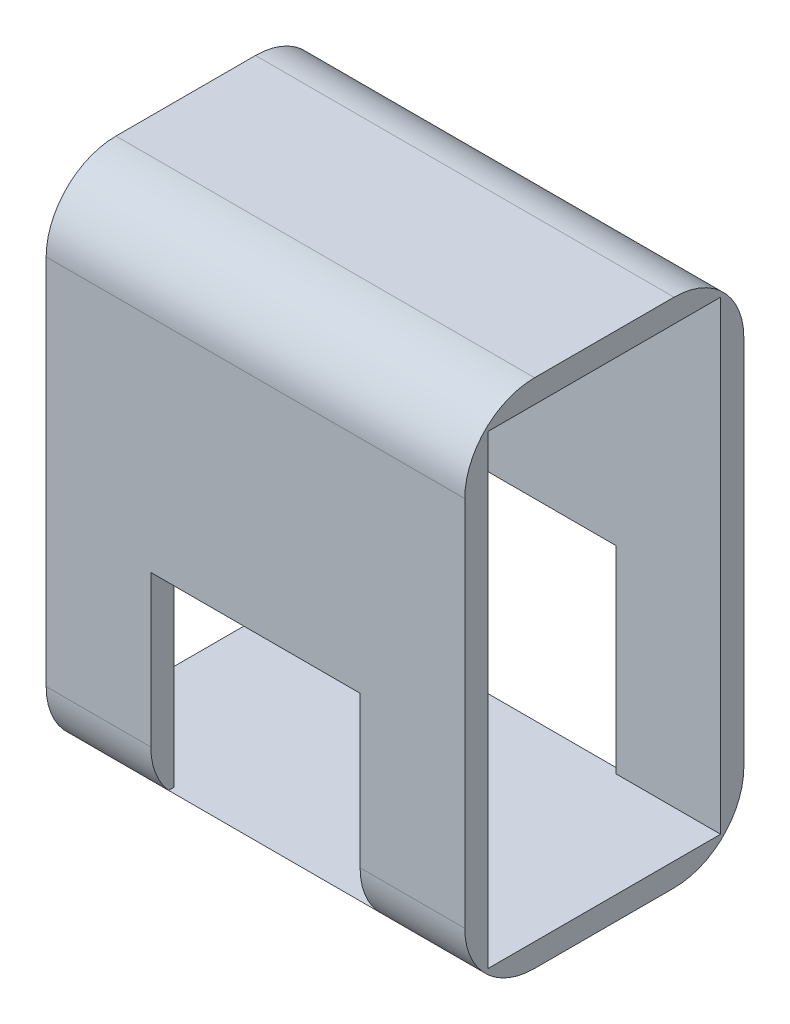
ISO-10303-21;
HEADER;
FILE_DESCRIPTION(('STEP AP214'),'2;1');
FILE_NAME('part.step','',(''),(''),'','','');
FILE_SCHEMA(('AUTOMOTIVE_DESIGN { 1 0 10303 214 1 1 1 1 }'));
ENDSEC;
DATA;
#1=APPLICATION_CONTEXT('core data for automotive mechanical design processes');
#2=APPLICATION_PROTOCOL_DEFINITION('international standard','automotive_design',2000,#1);
#3=PRODUCT_CONTEXT('',#1,'mechanical');
#4=PRODUCT('Part','Part','',(#3));
#5=PRODUCT_RELATED_PRODUCT_CATEGORY('part','',(#4));
#6=PRODUCT_DEFINITION_FORMATION('','',#4);
#7=PRODUCT_DEFINITION_CONTEXT('part definition',#1,'design');
#8=PRODUCT_DEFINITION('design','',#6,#7);
#9=PRODUCT_DEFINITION_SHAPE('','',#8);
#10=(LENGTH_UNIT() NAMED_UNIT(*) SI_UNIT(.MILLI.,.METRE.));
#11=(NAMED_UNIT(*) PLANE_ANGLE_UNIT() SI_UNIT($,.RADIAN.));
#12=(NAMED_UNIT(*) SI_UNIT($,.STERADIAN.) SOLID_ANGLE_UNIT());
#13=UNCERTAINTY_MEASURE_WITH_UNIT(LENGTH_MEASURE(1.E-05),#10,'distance_accuracy_value','');
#14=(GEOMETRIC_REPRESENTATION_CONTEXT(3) GLOBAL_UNCERTAINTY_ASSIGNED_CONTEXT((#13)) GLOBAL_UNIT_ASSIGNED_CONTEXT((#10,
#11,#12)) REPRESENTATION_CONTEXT('',''));
#15=CARTESIAN_POINT('',(0.,0.,0.));
#16=DIRECTION('',(0.,0.,1.));
#17=DIRECTION('',(1.,0.,0.));
#18=AXIS2_PLACEMENT_3D('',#15,#16,#17);
#19=CARTESIAN_POINT('',(0.,-10.,5.));
#20=DIRECTION('',(0.,-1.,0.));
#21=DIRECTION('',(0.,0.,-1.));
#22=AXIS2_PLACEMENT_3D('',#19,#20,#21);
#23=PLANE('',#22);
#24=DIRECTION('',(0.,0.,1.));
#25=VECTOR('',#24,1.);
#26=CARTESIAN_POINT('',(4.5,-10.,-5.11803398875));
#27=LINE('',#26,#25);
#28=CARTESIAN_POINT('',(4.5,-10.,-5.2360679775));
#29=VERTEX_POINT('',#28);
#30=CARTESIAN_POINT('',(4.5,-10.,-5.));
#31=VERTEX_POINT('',#30);
#32=EDGE_CURVE('E173',#29,#31,#27,.T.);
#33=ORIENTED_EDGE('',*,*,#32,.F.);
#34=DIRECTION('',(1.,0.,0.));
#35=VECTOR('',#34,1.);
#36=CARTESIAN_POINT('',(0.,-10.,-5.2360679775));
#37=LINE('',#36,#35);
#38=CARTESIAN_POINT('',(-4.5,-10.,-5.2360679775));
#39=VERTEX_POINT('',#38);
#40=EDGE_CURVE('E272',#39,#29,#37,.T.);
#41=ORIENTED_EDGE('',*,*,#40,.F.);
#42=DIRECTION('',(0.,0.,1.));
#43=VECTOR('',#42,1.);
#44=CARTESIAN_POINT('',(-4.5,-10.,-5.11803398875));
#45=LINE('',#44,#43);
#46=CARTESIAN_POINT('',(-4.5,-10.,-5.));
#47=VERTEX_POINT('',#46);
#48=EDGE_CURVE('E203',#39,#47,#45,.T.);
#49=ORIENTED_EDGE('',*,*,#48,.T.);
#50=DIRECTION('',(1.,0.,0.));
#51=VECTOR('',#50,1.);
#52=CARTESIAN_POINT('',(-6.75,-10.,-5.));
#53=LINE('',#52,#51);
#54=CARTESIAN_POINT('',(-9.,-10.,-5.));
#55=VERTEX_POINT('',#54);
#56=EDGE_CURVE('E198',#55,#47,#53,.T.);
#57=ORIENTED_EDGE('',*,*,#56,.F.);
#58=DIRECTION('',(0.,0.,-1.));
#59=VECTOR('',#58,1.);
#60=CARTESIAN_POINT('',(-9.,-10.,0.));
#61=LINE('',#60,#59);
#62=CARTESIAN_POINT('',(-9.,-10.,5.));
#63=VERTEX_POINT('',#62);
#64=EDGE_CURVE('E326',#63,#55,#61,.T.);
#65=ORIENTED_EDGE('',*,*,#64,.F.);
#66=DIRECTION('',(1.,0.,0.));
#67=VECTOR('',#66,1.);
#68=CARTESIAN_POINT('',(-6.75,-10.,5.));
#69=LINE('',#68,#67);
#70=CARTESIAN_POINT('',(-4.5,-10.,5.));
#71=VERTEX_POINT('',#70);
#72=EDGE_CURVE('E186',#63,#71,#69,.T.);
#73=ORIENTED_EDGE('',*,*,#72,.T.);
#74=DIRECTION('',(0.,0.,1.));
#75=VECTOR('',#74,1.);
#76=CARTESIAN_POINT('',(-4.5,-10.,5.11803398875));
#77=LINE('',#76,#75);
#78=CARTESIAN_POINT('',(-4.5,-10.,5.2360679775));
#79=VERTEX_POINT('',#78);
#80=EDGE_CURVE('E11',#71,#79,#77,.T.);
#81=ORIENTED_EDGE('',*,*,#80,.T.);
#82=DIRECTION('',(1.,0.,0.));
#83=VECTOR('',#82,1.);
#84=CARTESIAN_POINT('',(0.,-10.,5.2360679775));
#85=LINE('',#84,#83);
#86=CARTESIAN_POINT('',(4.5,-10.,5.2360679775));
#87=VERTEX_POINT('',#86);
#88=EDGE_CURVE('E277',#79,#87,#85,.T.);
#89=ORIENTED_EDGE('',*,*,#88,.T.);
#90=DIRECTION('',(0.,0.,1.));
#91=VECTOR('',#90,1.);
#92=CARTESIAN_POINT('',(4.5,-10.,5.11803398875));
#93=LINE('',#92,#91);
#94=CARTESIAN_POINT('',(4.5,-10.,5.));
#95=VERTEX_POINT('',#94);
#96=EDGE_CURVE('E20',#95,#87,#93,.T.);
#97=ORIENTED_EDGE('',*,*,#96,.F.);
#98=DIRECTION('',(1.,0.,0.));
#99=VECTOR('',#98,1.);
#100=CARTESIAN_POINT('',(6.75,-10.,5.));
#101=LINE('',#100,#99);
#102=CARTESIAN_POINT('',(9.,-10.,5.));
#103=VERTEX_POINT('',#102);
#104=EDGE_CURVE('E369',#95,#103,#101,.T.);
#105=ORIENTED_EDGE('',*,*,#104,.T.);
#106=DIRECTION('',(0.,0.,-1.));
#107=VECTOR('',#106,1.);
#108=CARTESIAN_POINT('',(9.,-10.,0.));
#109=LINE('',#108,#107);
#110=CARTESIAN_POINT('',(9.,-10.,-5.));
#111=VERTEX_POINT('',#110);
#112=EDGE_CURVE('E332',#103,#111,#109,.T.);
#113=ORIENTED_EDGE('',*,*,#112,.T.);
#114=DIRECTION('',(1.,0.,0.));
#115=VECTOR('',#114,1.);
#116=CARTESIAN_POINT('',(6.75,-10.,-5.));
#117=LINE('',#116,#115);
#118=EDGE_CURVE('E375',#31,#111,#117,.T.);
#119=ORIENTED_EDGE('',*,*,#118,.F.);
#120=EDGE_LOOP('',(#33,#41,#49,#57,#65,#73,#81,#89,#97,#105,#113,#119));
#121=FACE_BOUND('',#120,.T.);
#122=ADVANCED_FACE('F16',(#121),#23,.F.);
#123=CARTESIAN_POINT('',(4.5,-1.5,-6.));
#124=DIRECTION('',(0.,1.,0.));
#125=DIRECTION('',(1.,0.,0.));
#126=AXIS2_PLACEMENT_3D('',#123,#124,#125);
#127=PLANE('',#126);
#128=DIRECTION('',(0.,0.,1.));
#129=VECTOR('',#128,1.);
#130=CARTESIAN_POINT('',(4.5,-1.5,5.5));
#131=LINE('',#130,#129);
#132=CARTESIAN_POINT('',(4.5,-1.5,5.));
#133=VERTEX_POINT('',#132);
#134=CARTESIAN_POINT('',(4.5,-1.5,6.));
#135=VERTEX_POINT('',#134);
#136=EDGE_CURVE('E242',#133,#135,#131,.T.);
#137=ORIENTED_EDGE('',*,*,#136,.T.);
#138=DIRECTION('',(-1.,0.,0.));
#139=VECTOR('',#138,1.);
#140=CARTESIAN_POINT('',(0.,-1.5,6.));
#141=LINE('',#140,#139);
#142=CARTESIAN_POINT('',(-4.5,-1.5,6.));
#143=VERTEX_POINT('',#142);
#144=EDGE_CURVE('E293',#135,#143,#141,.T.);
#145=ORIENTED_EDGE('',*,*,#144,.T.);
#146=DIRECTION('',(0.,0.,1.));
#147=VECTOR('',#146,1.);
#148=CARTESIAN_POINT('',(-4.5,-1.5,5.5));
#149=LINE('',#148,#147);
#150=CARTESIAN_POINT('',(-4.5,-1.5,5.));
#151=VERTEX_POINT('',#150);
#152=EDGE_CURVE('E27',#151,#143,#149,.T.);
#153=ORIENTED_EDGE('',*,*,#152,.F.);
#154=DIRECTION('',(-1.,0.,0.));
#155=VECTOR('',#154,1.);
#156=CARTESIAN_POINT('',(0.,-1.5,5.));
#157=LINE('',#156,#155);
#158=EDGE_CURVE('E294',#133,#151,#157,.T.);
#159=ORIENTED_EDGE('',*,*,#158,.F.);
#160=EDGE_LOOP('',(#137,#145,#153,#159));
#161=FACE_BOUND('',#160,.T.);
#162=ADVANCED_FACE('F590',(#161),#127,.F.);
#163=CARTESIAN_POINT('',(-4.5,-10.,-6.));
#164=DIRECTION('',(1.,0.,0.));
#165=DIRECTION('',(0.,1.,0.));
#166=AXIS2_PLACEMENT_3D('',#163,#164,#165);
#167=PLANE('',#166);
#168=DIRECTION('',(0.,1.,0.));
#169=VECTOR('',#168,1.);
#170=CARTESIAN_POINT('',(-4.5,-5.75,5.));
#171=LINE('',#170,#169);
#172=EDGE_CURVE('E206',#71,#151,#171,.T.);
#173=ORIENTED_EDGE('',*,*,#172,.T.);
#174=ORIENTED_EDGE('',*,*,#152,.T.);
#175=DIRECTION('',(0.,1.,0.));
#176=VECTOR('',#175,1.);
#177=CARTESIAN_POINT('',(-4.5,-4.75,6.));
#178=LINE('',#177,#176);
#179=CARTESIAN_POINT('',(-4.5,-8.,6.));
#180=VERTEX_POINT('',#179);
#181=EDGE_CURVE('E289',#180,#143,#178,.T.);
#182=ORIENTED_EDGE('',*,*,#181,.F.);
#183=CARTESIAN_POINT('',(-4.5,-8.,3.));
#184=DIRECTION('',(1.,0.,0.));
#185=DIRECTION('',(0.,1.,0.));
#186=AXIS2_PLACEMENT_3D('',#183,#184,#185);
#187=CIRCLE('',#186,3.);
#188=EDGE_CURVE('E281',#180,#79,#187,.T.);
#189=ORIENTED_EDGE('',*,*,#188,.T.);
#190=ORIENTED_EDGE('',*,*,#80,.F.);
#191=EDGE_LOOP('',(#173,#174,#182,#189,#190));
#192=FACE_BOUND('',#191,.T.);
#193=ADVANCED_FACE('F502',(#192),#167,.T.);
#194=CARTESIAN_POINT('',(4.5,-1.5,-6.));
#195=DIRECTION('',(-1.,0.,0.));
#196=DIRECTION('',(0.,0.,1.));
#197=AXIS2_PLACEMENT_3D('',#194,#195,#196);
#198=PLANE('',#197);
#199=DIRECTION('',(0.,1.,0.));
#200=VECTOR('',#199,1.);
#201=CARTESIAN_POINT('',(4.5,-5.75,5.));
#202=LINE('',#201,#200);
#203=EDGE_CURVE('E297',#95,#133,#202,.T.);
#204=ORIENTED_EDGE('',*,*,#203,.F.);
#205=ORIENTED_EDGE('',*,*,#96,.T.);
#206=CARTESIAN_POINT('',(4.5,-8.,3.));
#207=DIRECTION('',(-1.,0.,0.));
#208=DIRECTION('',(0.,1.,0.));
#209=AXIS2_PLACEMENT_3D('',#206,#207,#208);
#210=CIRCLE('',#209,3.);
#211=CARTESIAN_POINT('',(4.5,-8.,6.));
#212=VERTEX_POINT('',#211);
#213=EDGE_CURVE('E246',#87,#212,#210,.T.);
#214=ORIENTED_EDGE('',*,*,#213,.T.);
#215=DIRECTION('',(0.,1.,0.));
#216=VECTOR('',#215,1.);
#217=CARTESIAN_POINT('',(4.5,-4.75,6.));
#218=LINE('',#217,#216);
#219=EDGE_CURVE('E372',#212,#135,#218,.T.);
#220=ORIENTED_EDGE('',*,*,#219,.T.);
#221=ORIENTED_EDGE('',*,*,#136,.F.);
#222=EDGE_LOOP('',(#204,#205,#214,#220,#221));
#223=FACE_BOUND('',#222,.T.);
#224=ADVANCED_FACE('F18',(#223),#198,.T.);
#225=CARTESIAN_POINT('',(4.5,-1.5,-6.));
#226=DIRECTION('',(0.,1.,0.));
#227=DIRECTION('',(1.,0.,0.));
#228=AXIS2_PLACEMENT_3D('',#225,#226,#227);
#229=PLANE('',#228);
#230=DIRECTION('',(-1.,0.,0.));
#231=VECTOR('',#230,1.);
#232=CARTESIAN_POINT('',(0.,-1.5,-5.));
#233=LINE('',#232,#231);
#234=CARTESIAN_POINT('',(4.5,-1.5,-5.));
#235=VERTEX_POINT('',#234);
#236=CARTESIAN_POINT('',(-4.5,-1.5,-5.));
#237=VERTEX_POINT('',#236);
#238=EDGE_CURVE('E165',#235,#237,#233,.T.);
#239=ORIENTED_EDGE('',*,*,#238,.T.);
#240=DIRECTION('',(0.,0.,1.));
#241=VECTOR('',#240,1.);
#242=CARTESIAN_POINT('',(-4.5,-1.5,-5.5));
#243=LINE('',#242,#241);
#244=CARTESIAN_POINT('',(-4.5,-1.5,-6.));
#245=VERTEX_POINT('',#244);
#246=EDGE_CURVE('E174',#245,#237,#243,.T.);
#247=ORIENTED_EDGE('',*,*,#246,.F.);
#248=DIRECTION('',(1.,0.,0.));
#249=VECTOR('',#248,1.);
#250=CARTESIAN_POINT('',(0.,-1.5,-6.));
#251=LINE('',#250,#249);
#252=CARTESIAN_POINT('',(4.5,-1.5,-6.));
#253=VERTEX_POINT('',#252);
#254=EDGE_CURVE('E168',#245,#253,#251,.T.);
#255=ORIENTED_EDGE('',*,*,#254,.T.);
#256=DIRECTION('',(0.,0.,1.));
#257=VECTOR('',#256,1.);
#258=CARTESIAN_POINT('',(4.5,-1.5,-5.5));
#259=LINE('',#258,#257);
#260=EDGE_CURVE('E160',#253,#235,#259,.T.);
#261=ORIENTED_EDGE('',*,*,#260,.T.);
#262=EDGE_LOOP('',(#239,#247,#255,#261));
#263=FACE_BOUND('',#262,.T.);
#264=ADVANCED_FACE('F162',(#263),#229,.F.);
#265=CARTESIAN_POINT('',(4.5,-1.5,-6.));
#266=DIRECTION('',(-1.,0.,0.));
#267=DIRECTION('',(0.,0.,1.));
#268=AXIS2_PLACEMENT_3D('',#265,#266,#267);
#269=PLANE('',#268);
#270=DIRECTION('',(0.,1.,0.));
#271=VECTOR('',#270,1.);
#272=CARTESIAN_POINT('',(4.5,-5.75,-5.));
#273=LINE('',#272,#271);
#274=EDGE_CURVE('E178',#31,#235,#273,.T.);
#275=ORIENTED_EDGE('',*,*,#274,.T.);
#276=ORIENTED_EDGE('',*,*,#260,.F.);
#277=DIRECTION('',(0.,-1.,0.));
#278=VECTOR('',#277,1.);
#279=CARTESIAN_POINT('',(4.5,-4.75,-6.));
#280=LINE('',#279,#278);
#281=CARTESIAN_POINT('',(4.5,-8.,-6.));
#282=VERTEX_POINT('',#281);
#283=EDGE_CURVE('E276',#253,#282,#280,.T.);
#284=ORIENTED_EDGE('',*,*,#283,.T.);
#285=CARTESIAN_POINT('',(4.5,-8.,-3.));
#286=DIRECTION('',(-1.,0.,0.));
#287=DIRECTION('',(0.,1.,0.));
#288=AXIS2_PLACEMENT_3D('',#285,#286,#287);
#289=CIRCLE('',#288,3.);
#290=EDGE_CURVE('E269',#282,#29,#289,.T.);
#291=ORIENTED_EDGE('',*,*,#290,.T.);
#292=ORIENTED_EDGE('',*,*,#32,.T.);
#293=EDGE_LOOP('',(#275,#276,#284,#291,#292));
#294=FACE_BOUND('',#293,.T.);
#295=ADVANCED_FACE('F179',(#294),#269,.T.);
#296=CARTESIAN_POINT('',(-4.5,-10.,-6.));
#297=DIRECTION('',(1.,0.,0.));
#298=DIRECTION('',(0.,1.,0.));
#299=AXIS2_PLACEMENT_3D('',#296,#297,#298);
#300=PLANE('',#299);
#301=DIRECTION('',(0.,1.,0.));
#302=VECTOR('',#301,1.);
#303=CARTESIAN_POINT('',(-4.5,-5.75,-5.));
#304=LINE('',#303,#302);
#305=EDGE_CURVE('E191',#47,#237,#304,.T.);
#306=ORIENTED_EDGE('',*,*,#305,.F.);
#307=ORIENTED_EDGE('',*,*,#48,.F.);
#308=CARTESIAN_POINT('',(-4.5,-8.,-3.));
#309=DIRECTION('',(1.,0.,0.));
#310=DIRECTION('',(0.,1.,0.));
#311=AXIS2_PLACEMENT_3D('',#308,#309,#310);
#312=CIRCLE('',#311,3.);
#313=CARTESIAN_POINT('',(-4.5,-8.,-6.));
#314=VERTEX_POINT('',#313);
#315=EDGE_CURVE('E351',#39,#314,#312,.T.);
#316=ORIENTED_EDGE('',*,*,#315,.T.);
#317=DIRECTION('',(0.,1.,0.));
#318=VECTOR('',#317,1.);
#319=CARTESIAN_POINT('',(-4.5,-4.75,-6.));
#320=LINE('',#319,#318);
#321=EDGE_CURVE('E275',#314,#245,#320,.T.);
#322=ORIENTED_EDGE('',*,*,#321,.T.);
#323=ORIENTED_EDGE('',*,*,#246,.T.);
#324=EDGE_LOOP('',(#306,#307,#316,#322,#323));
#325=FACE_BOUND('',#324,.T.);
#326=ADVANCED_FACE('F467',(#325),#300,.T.);
#327=CARTESIAN_POINT('',(0.,-10.,5.));
#328=DIRECTION('',(0.,0.,-1.));
#329=DIRECTION('',(0.,-1.,0.));
#330=AXIS2_PLACEMENT_3D('',#327,#328,#329);
#331=PLANE('',#330);
#332=ORIENTED_EDGE('',*,*,#72,.F.);
#333=DIRECTION('',(0.,-1.,0.));
#334=VECTOR('',#333,1.);
#335=CARTESIAN_POINT('',(-9.,0.,5.));
#336=LINE('',#335,#334);
#337=CARTESIAN_POINT('',(-9.,10.,5.));
#338=VERTEX_POINT('',#337);
#339=EDGE_CURVE('E259',#338,#63,#336,.T.);
#340=ORIENTED_EDGE('',*,*,#339,.F.);
#341=DIRECTION('',(1.,0.,0.));
#342=VECTOR('',#341,1.);
#343=CARTESIAN_POINT('',(0.,10.,5.));
#344=LINE('',#343,#342);
#345=CARTESIAN_POINT('',(9.,10.,5.));
#346=VERTEX_POINT('',#345);
#347=EDGE_CURVE('E288',#338,#346,#344,.T.);
#348=ORIENTED_EDGE('',*,*,#347,.T.);
#349=DIRECTION('',(0.,-1.,0.));
#350=VECTOR('',#349,1.);
#351=CARTESIAN_POINT('',(9.,0.,5.));
#352=LINE('',#351,#350);
#353=EDGE_CURVE('E355',#346,#103,#352,.T.);
#354=ORIENTED_EDGE('',*,*,#353,.T.);
#355=ORIENTED_EDGE('',*,*,#104,.F.);
#356=ORIENTED_EDGE('',*,*,#203,.T.);
#357=ORIENTED_EDGE('',*,*,#158,.T.);
#358=ORIENTED_EDGE('',*,*,#172,.F.);
#359=EDGE_LOOP('',(#332,#340,#348,#354,#355,#356,#357,#358));
#360=FACE_BOUND('',#359,.T.);
#361=ADVANCED_FACE('F432',(#360),#331,.T.);
#362=CARTESIAN_POINT('',(0.,10.,-5.));
#363=DIRECTION('',(0.,0.,1.));
#364=DIRECTION('',(1.,0.,0.));
#365=AXIS2_PLACEMENT_3D('',#362,#363,#364);
#366=PLANE('',#365);
#367=ORIENTED_EDGE('',*,*,#118,.T.);
#368=DIRECTION('',(0.,1.,0.));
#369=VECTOR('',#368,1.);
#370=CARTESIAN_POINT('',(9.,0.,-5.));
#371=LINE('',#370,#369);
#372=CARTESIAN_POINT('',(9.,10.,-5.));
#373=VERTEX_POINT('',#372);
#374=EDGE_CURVE('E201',#111,#373,#371,.T.);
#375=ORIENTED_EDGE('',*,*,#374,.T.);
#376=DIRECTION('',(1.,0.,0.));
#377=VECTOR('',#376,1.);
#378=CARTESIAN_POINT('',(0.,10.,-5.));
#379=LINE('',#378,#377);
#380=CARTESIAN_POINT('',(-9.,10.,-5.));
#381=VERTEX_POINT('',#380);
#382=EDGE_CURVE('E254',#381,#373,#379,.T.);
#383=ORIENTED_EDGE('',*,*,#382,.F.);
#384=DIRECTION('',(0.,1.,0.));
#385=VECTOR('',#384,1.);
#386=CARTESIAN_POINT('',(-9.,0.,-5.));
#387=LINE('',#386,#385);
#388=EDGE_CURVE('E264',#55,#381,#387,.T.);
#389=ORIENTED_EDGE('',*,*,#388,.F.);
#390=ORIENTED_EDGE('',*,*,#56,.T.);
#391=ORIENTED_EDGE('',*,*,#305,.T.);
#392=ORIENTED_EDGE('',*,*,#238,.F.);
#393=ORIENTED_EDGE('',*,*,#274,.F.);
#394=EDGE_LOOP('',(#367,#375,#383,#389,#390,#391,#392,#393));
#395=FACE_BOUND('',#394,.T.);
#396=ADVANCED_FACE('F188',(#395),#366,.T.);
#397=CARTESIAN_POINT('',(0.,11.,6.));
#398=DIRECTION('',(0.,0.,1.));
#399=DIRECTION('',(1.,0.,0.));
#400=AXIS2_PLACEMENT_3D('',#397,#398,#399);
#401=PLANE('',#400);
#402=DIRECTION('',(1.,0.,0.));
#403=VECTOR('',#402,1.);
#404=CARTESIAN_POINT('',(0.,-8.,6.));
#405=LINE('',#404,#403);
#406=CARTESIAN_POINT('',(9.,-8.,6.));
#407=VERTEX_POINT('',#406);
#408=EDGE_CURVE('E244',#212,#407,#405,.T.);
#409=ORIENTED_EDGE('',*,*,#408,.T.);
#410=DIRECTION('',(0.,-1.,0.));
#411=VECTOR('',#410,1.);
#412=CARTESIAN_POINT('',(9.,0.,6.));
#413=LINE('',#412,#411);
#414=CARTESIAN_POINT('',(9.,8.,6.));
#415=VERTEX_POINT('',#414);
#416=EDGE_CURVE('E263',#415,#407,#413,.T.);
#417=ORIENTED_EDGE('',*,*,#416,.F.);
#418=DIRECTION('',(1.,0.,0.));
#419=VECTOR('',#418,1.);
#420=CARTESIAN_POINT('',(0.,8.,6.));
#421=LINE('',#420,#419);
#422=CARTESIAN_POINT('',(-9.,8.,6.));
#423=VERTEX_POINT('',#422);
#424=EDGE_CURVE('E213',#423,#415,#421,.T.);
#425=ORIENTED_EDGE('',*,*,#424,.F.);
#426=DIRECTION('',(0.,-1.,0.));
#427=VECTOR('',#426,1.);
#428=CARTESIAN_POINT('',(-9.,0.,6.));
#429=LINE('',#428,#427);
#430=CARTESIAN_POINT('',(-9.,-8.,6.));
#431=VERTEX_POINT('',#430);
#432=EDGE_CURVE('E323',#423,#431,#429,.T.);
#433=ORIENTED_EDGE('',*,*,#432,.T.);
#434=DIRECTION('',(1.,0.,0.));
#435=VECTOR('',#434,1.);
#436=CARTESIAN_POINT('',(0.,-8.,6.));
#437=LINE('',#436,#435);
#438=EDGE_CURVE('E247',#431,#180,#437,.T.);
#439=ORIENTED_EDGE('',*,*,#438,.T.);
#440=ORIENTED_EDGE('',*,*,#181,.T.);
#441=ORIENTED_EDGE('',*,*,#144,.F.);
#442=ORIENTED_EDGE('',*,*,#219,.F.);
#443=EDGE_LOOP('',(#409,#417,#425,#433,#439,#440,#441,#442));
#444=FACE_BOUND('',#443,.T.);
#445=ADVANCED_FACE('F541',(#444),#401,.T.);
#446=CARTESIAN_POINT('',(0.,-8.,3.));
#447=DIRECTION('',(1.,0.,0.));
#448=DIRECTION('',(0.,0.,1.));
#449=AXIS2_PLACEMENT_3D('',#446,#447,#448);
#450=CYLINDRICAL_SURFACE('',#449,3.);
#451=ORIENTED_EDGE('',*,*,#438,.F.);
#452=CARTESIAN_POINT('',(-9.,-8.,3.));
#453=DIRECTION('',(1.,0.,0.));
#454=DIRECTION('',(0.,1.,0.));
#455=AXIS2_PLACEMENT_3D('',#452,#453,#454);
#456=CIRCLE('',#455,3.);
#457=CARTESIAN_POINT('',(-9.,-11.,3.));
#458=VERTEX_POINT('',#457);
#459=EDGE_CURVE('E327',#431,#458,#456,.T.);
#460=ORIENTED_EDGE('',*,*,#459,.T.);
#461=DIRECTION('',(1.,0.,0.));
#462=VECTOR('',#461,1.);
#463=CARTESIAN_POINT('',(0.,-11.,3.));
#464=LINE('',#463,#462);
#465=CARTESIAN_POINT('',(9.,-11.,3.));
#466=VERTEX_POINT('',#465);
#467=EDGE_CURVE('E226',#458,#466,#464,.T.);
#468=ORIENTED_EDGE('',*,*,#467,.T.);
#469=CARTESIAN_POINT('',(9.,-8.,3.));
#470=DIRECTION('',(-1.,0.,0.));
#471=DIRECTION('',(0.,1.,0.));
#472=AXIS2_PLACEMENT_3D('',#469,#470,#471);
#473=CIRCLE('',#472,3.);
#474=EDGE_CURVE('E343',#466,#407,#473,.T.);
#475=ORIENTED_EDGE('',*,*,#474,.T.);
#476=ORIENTED_EDGE('',*,*,#408,.F.);
#477=ORIENTED_EDGE('',*,*,#213,.F.);
#478=ORIENTED_EDGE('',*,*,#88,.F.);
#479=ORIENTED_EDGE('',*,*,#188,.F.);
#480=EDGE_LOOP('',(#451,#460,#468,#475,#476,#477,#478,#479));
#481=FACE_BOUND('',#480,.T.);
#482=ADVANCED_FACE('F560',(#481),#450,.T.);
#483=CARTESIAN_POINT('',(0.,-8.,-3.));
#484=DIRECTION('',(1.,0.,0.));
#485=DIRECTION('',(0.,-1.,0.));
#486=AXIS2_PLACEMENT_3D('',#483,#484,#485);
#487=CYLINDRICAL_SURFACE('',#486,3.);
#488=DIRECTION('',(1.,0.,0.));
#489=VECTOR('',#488,1.);
#490=CARTESIAN_POINT('',(6.75,-8.,-6.));
#491=LINE('',#490,#489);
#492=CARTESIAN_POINT('',(9.,-8.,-6.));
#493=VERTEX_POINT('',#492);
#494=EDGE_CURVE('E252',#282,#493,#491,.T.);
#495=ORIENTED_EDGE('',*,*,#494,.T.);
#496=CARTESIAN_POINT('',(9.,-8.,-3.));
#497=DIRECTION('',(-1.,0.,0.));
#498=DIRECTION('',(0.,1.,0.));
#499=AXIS2_PLACEMENT_3D('',#496,#497,#498);
#500=CIRCLE('',#499,3.);
#501=CARTESIAN_POINT('',(9.,-11.,-3.));
#502=VERTEX_POINT('',#501);
#503=EDGE_CURVE('E347',#493,#502,#500,.T.);
#504=ORIENTED_EDGE('',*,*,#503,.T.);
#505=DIRECTION('',(1.,0.,0.));
#506=VECTOR('',#505,1.);
#507=CARTESIAN_POINT('',(0.,-11.,-3.));
#508=LINE('',#507,#506);
#509=CARTESIAN_POINT('',(-9.,-11.,-3.));
#510=VERTEX_POINT('',#509);
#511=EDGE_CURVE('E301',#510,#502,#508,.T.);
#512=ORIENTED_EDGE('',*,*,#511,.F.);
#513=CARTESIAN_POINT('',(-9.,-8.,-3.));
#514=DIRECTION('',(1.,0.,0.));
#515=DIRECTION('',(0.,1.,0.));
#516=AXIS2_PLACEMENT_3D('',#513,#514,#515);
#517=CIRCLE('',#516,3.);
#518=CARTESIAN_POINT('',(-9.,-8.,-6.));
#519=VERTEX_POINT('',#518);
#520=EDGE_CURVE('E211',#510,#519,#517,.T.);
#521=ORIENTED_EDGE('',*,*,#520,.T.);
#522=DIRECTION('',(1.,0.,0.));
#523=VECTOR('',#522,1.);
#524=CARTESIAN_POINT('',(-6.75,-8.,-6.));
#525=LINE('',#524,#523);
#526=EDGE_CURVE('E248',#519,#314,#525,.T.);
#527=ORIENTED_EDGE('',*,*,#526,.T.);
#528=ORIENTED_EDGE('',*,*,#315,.F.);
#529=ORIENTED_EDGE('',*,*,#40,.T.);
#530=ORIENTED_EDGE('',*,*,#290,.F.);
#531=EDGE_LOOP('',(#495,#504,#512,#521,#527,#528,#529,#530));
#532=FACE_BOUND('',#531,.T.);
#533=ADVANCED_FACE('F460',(#532),#487,.T.);
#534=CARTESIAN_POINT('',(0.,-11.,-6.));
#535=DIRECTION('',(0.,0.,-1.));
#536=DIRECTION('',(0.,-1.,0.));
#537=AXIS2_PLACEMENT_3D('',#534,#535,#536);
#538=PLANE('',#537);
#539=ORIENTED_EDGE('',*,*,#526,.F.);
#540=DIRECTION('',(0.,1.,0.));
#541=VECTOR('',#540,1.);
#542=CARTESIAN_POINT('',(-9.,0.,-6.));
#543=LINE('',#542,#541);
#544=CARTESIAN_POINT('',(-9.,8.,-6.));
#545=VERTEX_POINT('',#544);
#546=EDGE_CURVE('E207',#519,#545,#543,.T.);
#547=ORIENTED_EDGE('',*,*,#546,.T.);
#548=DIRECTION('',(1.,0.,0.));
#549=VECTOR('',#548,1.);
#550=CARTESIAN_POINT('',(0.,8.,-6.));
#551=LINE('',#550,#549);
#552=CARTESIAN_POINT('',(9.,8.,-6.));
#553=VERTEX_POINT('',#552);
#554=EDGE_CURVE('E253',#545,#553,#551,.T.);
#555=ORIENTED_EDGE('',*,*,#554,.T.);
#556=DIRECTION('',(0.,1.,0.));
#557=VECTOR('',#556,1.);
#558=CARTESIAN_POINT('',(9.,0.,-6.));
#559=LINE('',#558,#557);
#560=EDGE_CURVE('E394',#493,#553,#559,.T.);
#561=ORIENTED_EDGE('',*,*,#560,.F.);
#562=ORIENTED_EDGE('',*,*,#494,.F.);
#563=ORIENTED_EDGE('',*,*,#283,.F.);
#564=ORIENTED_EDGE('',*,*,#254,.F.);
#565=ORIENTED_EDGE('',*,*,#321,.F.);
#566=EDGE_LOOP('',(#539,#547,#555,#561,#562,#563,#564,#565));
#567=FACE_BOUND('',#566,.T.);
#568=ADVANCED_FACE('F469',(#567),#538,.T.);
#569=CARTESIAN_POINT('',(0.,8.,-3.));
#570=DIRECTION('',(1.,0.,0.));
#571=DIRECTION('',(0.,0.,-1.));
#572=AXIS2_PLACEMENT_3D('',#569,#570,#571);
#573=CYLINDRICAL_SURFACE('',#572,3.);
#574=CARTESIAN_POINT('',(9.,8.,-3.));
#575=DIRECTION('',(-1.,0.,0.));
#576=DIRECTION('',(0.,1.,0.));
#577=AXIS2_PLACEMENT_3D('',#574,#575,#576);
#578=CIRCLE('',#577,3.);
#579=CARTESIAN_POINT('',(9.,11.,-3.));
#580=VERTEX_POINT('',#579);
#581=EDGE_CURVE('E359',#580,#553,#578,.T.);
#582=ORIENTED_EDGE('',*,*,#581,.T.);
#583=ORIENTED_EDGE('',*,*,#554,.F.);
#584=CARTESIAN_POINT('',(-9.,8.,-3.));
#585=DIRECTION('',(1.,0.,0.));
#586=DIRECTION('',(0.,1.,0.));
#587=AXIS2_PLACEMENT_3D('',#584,#585,#586);
#588=CIRCLE('',#587,3.);
#589=CARTESIAN_POINT('',(-9.,11.,-3.));
#590=VERTEX_POINT('',#589);
#591=EDGE_CURVE('E212',#545,#590,#588,.T.);
#592=ORIENTED_EDGE('',*,*,#591,.T.);
#593=DIRECTION('',(1.,0.,0.));
#594=VECTOR('',#593,1.);
#595=CARTESIAN_POINT('',(0.,11.,-3.));
#596=LINE('',#595,#594);
#597=EDGE_CURVE('E308',#590,#580,#596,.T.);
#598=ORIENTED_EDGE('',*,*,#597,.T.);
#599=EDGE_LOOP('',(#582,#583,#592,#598));
#600=FACE_BOUND('',#599,.T.);
#601=ADVANCED_FACE('F528',(#600),#573,.T.);
#602=CARTESIAN_POINT('',(9.,0.,0.));
#603=DIRECTION('',(1.,0.,0.));
#604=DIRECTION('',(0.,1.,0.));
#605=AXIS2_PLACEMENT_3D('',#602,#603,#604);
#606=PLANE('',#605);
#607=ORIENTED_EDGE('',*,*,#353,.F.);
#608=DIRECTION('',(0.,0.,1.));
#609=VECTOR('',#608,1.);
#610=CARTESIAN_POINT('',(9.,10.,0.));
#611=LINE('',#610,#609);
#612=EDGE_CURVE('E360',#373,#346,#611,.T.);
#613=ORIENTED_EDGE('',*,*,#612,.F.);
#614=ORIENTED_EDGE('',*,*,#374,.F.);
#615=ORIENTED_EDGE('',*,*,#112,.F.);
#616=EDGE_LOOP('',(#607,#613,#614,#615));
#617=FACE_BOUND('',#616,.T.);
#618=DIRECTION('',(0.,0.,1.));
#619=VECTOR('',#618,1.);
#620=CARTESIAN_POINT('',(9.,11.,0.));
#621=LINE('',#620,#619);
#622=CARTESIAN_POINT('',(9.,11.,3.));
#623=VERTEX_POINT('',#622);
#624=EDGE_CURVE('E300',#580,#623,#621,.T.);
#625=ORIENTED_EDGE('',*,*,#624,.T.);
#626=CARTESIAN_POINT('',(9.,8.,3.));
#627=DIRECTION('',(-1.,0.,0.));
#628=DIRECTION('',(0.,1.,0.));
#629=AXIS2_PLACEMENT_3D('',#626,#627,#628);
#630=CIRCLE('',#629,3.);
#631=EDGE_CURVE('E238',#415,#623,#630,.T.);
#632=ORIENTED_EDGE('',*,*,#631,.F.);
#633=ORIENTED_EDGE('',*,*,#416,.T.);
#634=ORIENTED_EDGE('',*,*,#474,.F.);
#635=DIRECTION('',(0.,0.,-1.));
#636=VECTOR('',#635,1.);
#637=CARTESIAN_POINT('',(9.,-11.,0.));
#638=LINE('',#637,#636);
#639=EDGE_CURVE('E216',#466,#502,#638,.T.);
#640=ORIENTED_EDGE('',*,*,#639,.T.);
#641=ORIENTED_EDGE('',*,*,#503,.F.);
#642=ORIENTED_EDGE('',*,*,#560,.T.);
#643=ORIENTED_EDGE('',*,*,#581,.F.);
#644=EDGE_LOOP('',(#625,#632,#633,#634,#640,#641,#642,#643));
#645=FACE_BOUND('',#644,.T.);
#646=ADVANCED_FACE('F428',(#617,#645),#606,.T.);
#647=CARTESIAN_POINT('',(-9.,0.,0.));
#648=DIRECTION('',(1.,0.,0.));
#649=DIRECTION('',(0.,1.,0.));
#650=AXIS2_PLACEMENT_3D('',#647,#648,#649);
#651=PLANE('',#650);
#652=ORIENTED_EDGE('',*,*,#64,.T.);
#653=ORIENTED_EDGE('',*,*,#388,.T.);
#654=DIRECTION('',(0.,0.,1.));
#655=VECTOR('',#654,1.);
#656=CARTESIAN_POINT('',(-9.,10.,0.));
#657=LINE('',#656,#655);
#658=EDGE_CURVE('E258',#381,#338,#657,.T.);
#659=ORIENTED_EDGE('',*,*,#658,.T.);
#660=ORIENTED_EDGE('',*,*,#339,.T.);
#661=EDGE_LOOP('',(#652,#653,#659,#660));
#662=FACE_BOUND('',#661,.T.);
#663=ORIENTED_EDGE('',*,*,#591,.F.);
#664=ORIENTED_EDGE('',*,*,#546,.F.);
#665=ORIENTED_EDGE('',*,*,#520,.F.);
#666=DIRECTION('',(0.,0.,-1.));
#667=VECTOR('',#666,1.);
#668=CARTESIAN_POINT('',(-9.,-11.,0.));
#669=LINE('',#668,#667);
#670=EDGE_CURVE('E268',#458,#510,#669,.T.);
#671=ORIENTED_EDGE('',*,*,#670,.F.);
#672=ORIENTED_EDGE('',*,*,#459,.F.);
#673=ORIENTED_EDGE('',*,*,#432,.F.);
#674=CARTESIAN_POINT('',(-9.,8.,3.));
#675=DIRECTION('',(1.,0.,0.));
#676=DIRECTION('',(0.,1.,0.));
#677=AXIS2_PLACEMENT_3D('',#674,#675,#676);
#678=CIRCLE('',#677,3.);
#679=CARTESIAN_POINT('',(-9.,11.,3.));
#680=VERTEX_POINT('',#679);
#681=EDGE_CURVE('E217',#680,#423,#678,.T.);
#682=ORIENTED_EDGE('',*,*,#681,.F.);
#683=DIRECTION('',(0.,0.,1.));
#684=VECTOR('',#683,1.);
#685=CARTESIAN_POINT('',(-9.,11.,0.));
#686=LINE('',#685,#684);
#687=EDGE_CURVE('E298',#590,#680,#686,.T.);
#688=ORIENTED_EDGE('',*,*,#687,.F.);
#689=EDGE_LOOP('',(#663,#664,#665,#671,#672,#673,#682,#688));
#690=FACE_BOUND('',#689,.T.);
#691=ADVANCED_FACE('F527',(#662,#690),#651,.F.);
#692=CARTESIAN_POINT('',(0.,11.,-6.));
#693=DIRECTION('',(0.,1.,0.));
#694=DIRECTION('',(1.,0.,0.));
#695=AXIS2_PLACEMENT_3D('',#692,#693,#694);
#696=PLANE('',#695);
#697=ORIENTED_EDGE('',*,*,#687,.T.);
#698=DIRECTION('',(1.,0.,0.));
#699=VECTOR('',#698,1.);
#700=CARTESIAN_POINT('',(0.,11.,3.));
#701=LINE('',#700,#699);
#702=EDGE_CURVE('E229',#680,#623,#701,.T.);
#703=ORIENTED_EDGE('',*,*,#702,.T.);
#704=ORIENTED_EDGE('',*,*,#624,.F.);
#705=ORIENTED_EDGE('',*,*,#597,.F.);
#706=EDGE_LOOP('',(#697,#703,#704,#705));
#707=FACE_BOUND('',#706,.T.);
#708=ADVANCED_FACE('F573',(#707),#696,.T.);
#709=CARTESIAN_POINT('',(0.,-11.,6.));
#710=DIRECTION('',(0.,-1.,0.));
#711=DIRECTION('',(0.,0.,-1.));
#712=AXIS2_PLACEMENT_3D('',#709,#710,#711);
#713=PLANE('',#712);
#714=ORIENTED_EDGE('',*,*,#639,.F.);
#715=ORIENTED_EDGE('',*,*,#467,.F.);
#716=ORIENTED_EDGE('',*,*,#670,.T.);
#717=ORIENTED_EDGE('',*,*,#511,.T.);
#718=EDGE_LOOP('',(#714,#715,#716,#717));
#719=FACE_BOUND('',#718,.T.);
#720=ADVANCED_FACE('F578',(#719),#713,.T.);
#721=CARTESIAN_POINT('',(0.,8.,3.));
#722=DIRECTION('',(1.,0.,0.));
#723=DIRECTION('',(0.,1.,0.));
#724=AXIS2_PLACEMENT_3D('',#721,#722,#723);
#725=CYLINDRICAL_SURFACE('',#724,3.);
#726=ORIENTED_EDGE('',*,*,#631,.T.);
#727=ORIENTED_EDGE('',*,*,#702,.F.);
#728=ORIENTED_EDGE('',*,*,#681,.T.);
#729=ORIENTED_EDGE('',*,*,#424,.T.);
#730=EDGE_LOOP('',(#726,#727,#728,#729));
#731=FACE_BOUND('',#730,.T.);
#732=ADVANCED_FACE('F660',(#731),#725,.T.);
#733=CARTESIAN_POINT('',(0.,10.,-5.));
#734=DIRECTION('',(0.,1.,0.));
#735=DIRECTION('',(1.,0.,0.));
#736=AXIS2_PLACEMENT_3D('',#733,#734,#735);
#737=PLANE('',#736);
#738=ORIENTED_EDGE('',*,*,#612,.T.);
#739=ORIENTED_EDGE('',*,*,#347,.F.);
#740=ORIENTED_EDGE('',*,*,#658,.F.);
#741=ORIENTED_EDGE('',*,*,#382,.T.);
#742=EDGE_LOOP('',(#738,#739,#740,#741));
#743=FACE_BOUND('',#742,.T.);
#744=ADVANCED_FACE('F437',(#743),#737,.F.);
#745=CLOSED_SHELL('',(#122,#162,#193,#224,#264,#295,#326,#361,#396,#445,#482,#533,#568,#601,
#646,#691,#708,#720,#732,#744));
#746=MANIFOLD_SOLID_BREP('B1',#745);
#747=ADVANCED_BREP_SHAPE_REPRESENTATION('',(#18,#746),#14);
#748=SHAPE_DEFINITION_REPRESENTATION(#9,#747);
ENDSEC;
END-ISO-10303-21;
